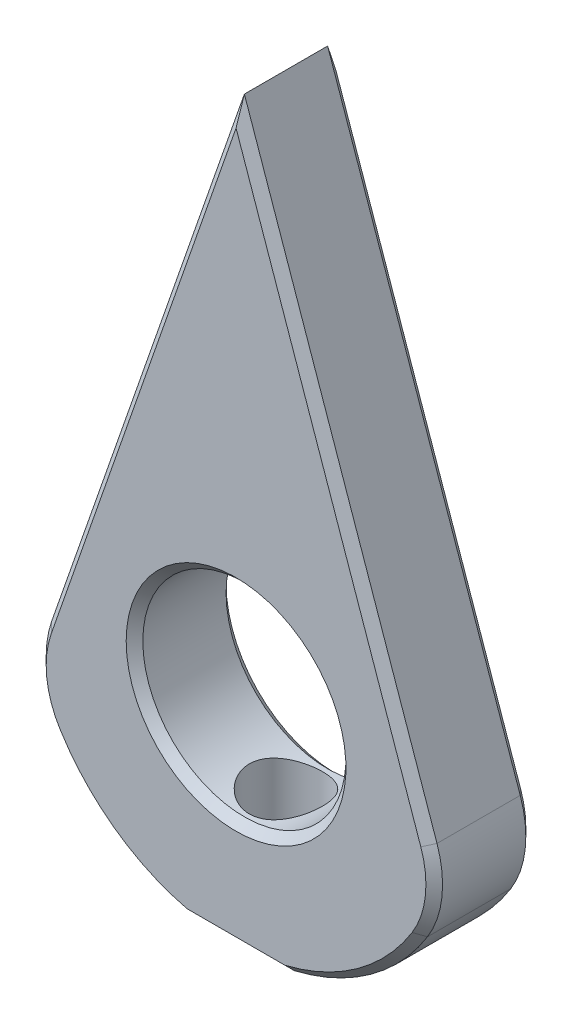
ISO-10303-21;
HEADER;
FILE_DESCRIPTION(('STEP AP214'),'2;1');
FILE_NAME('part.step','',(''),(''),'','','');
FILE_SCHEMA(('AUTOMOTIVE_DESIGN { 1 0 10303 214 1 1 1 1 }'));
ENDSEC;
DATA;
#1=APPLICATION_CONTEXT('core data for automotive mechanical design processes');
#2=APPLICATION_PROTOCOL_DEFINITION('international standard','automotive_design',2000,#1);
#3=PRODUCT_CONTEXT('',#1,'mechanical');
#4=PRODUCT('Part','Part','',(#3));
#5=PRODUCT_RELATED_PRODUCT_CATEGORY('part','',(#4));
#6=PRODUCT_DEFINITION_FORMATION('','',#4);
#7=PRODUCT_DEFINITION_CONTEXT('part definition',#1,'design');
#8=PRODUCT_DEFINITION('design','',#6,#7);
#9=PRODUCT_DEFINITION_SHAPE('','',#8);
#10=(LENGTH_UNIT() NAMED_UNIT(*) SI_UNIT(.MILLI.,.METRE.));
#11=(NAMED_UNIT(*) PLANE_ANGLE_UNIT() SI_UNIT($,.RADIAN.));
#12=(NAMED_UNIT(*) SI_UNIT($,.STERADIAN.) SOLID_ANGLE_UNIT());
#13=UNCERTAINTY_MEASURE_WITH_UNIT(LENGTH_MEASURE(1.E-05),#10,'distance_accuracy_value','');
#14=(GEOMETRIC_REPRESENTATION_CONTEXT(3) GLOBAL_UNCERTAINTY_ASSIGNED_CONTEXT((#13)) GLOBAL_UNIT_ASSIGNED_CONTEXT((#10,
#11,#12)) REPRESENTATION_CONTEXT('',''));
#15=CARTESIAN_POINT('',(0.,0.,0.));
#16=DIRECTION('',(0.,0.,1.));
#17=DIRECTION('',(1.,0.,0.));
#18=AXIS2_PLACEMENT_3D('',#15,#16,#17);
#19=CARTESIAN_POINT('',(0.,0.,6.));
#20=DIRECTION('',(0.,0.,-1.));
#21=DIRECTION('',(-1.,0.,0.));
#22=AXIS2_PLACEMENT_3D('',#19,#20,#21);
#23=PLANE('',#22);
#24=CARTESIAN_POINT('',(0.,0.,6.));
#25=DIRECTION('',(0.,0.,-1.));
#26=DIRECTION('',(-1.,0.,0.));
#27=AXIS2_PLACEMENT_3D('',#24,#25,#26);
#28=CIRCLE('',#27,6.59999999999999);
#29=CARTESIAN_POINT('',(-6.59999999999999,0.,6.));
#30=VERTEX_POINT('',#29);
#31=EDGE_CURVE('E11',#30,#30,#28,.T.);
#32=ORIENTED_EDGE('',*,*,#31,.T.);
#33=EDGE_LOOP('',(#32));
#34=FACE_BOUND('',#33,.T.);
#35=CARTESIAN_POINT('',(0.,0.,6.));
#36=DIRECTION('',(0.,0.,-1.));
#37=DIRECTION('',(-1.,0.,0.));
#38=AXIS2_PLACEMENT_3D('',#35,#36,#37);
#39=CIRCLE('',#38,12.4522198869537);
#40=CARTESIAN_POINT('',(-10.5754175678357,-6.57406444895071,6.));
#41=VERTEX_POINT('',#40);
#42=CARTESIAN_POINT('',(-2.94071081765043,-12.1,6.));
#43=VERTEX_POINT('',#42);
#44=EDGE_CURVE('E56',#41,#43,#39,.F.);
#45=ORIENTED_EDGE('',*,*,#44,.T.);
#46=DIRECTION('',(1.,0.,0.));
#47=VECTOR('',#46,1.);
#48=CARTESIAN_POINT('',(0.,-12.1,6.));
#49=LINE('',#48,#47);
#50=CARTESIAN_POINT('',(2.94071081765042,-12.1,6.));
#51=VERTEX_POINT('',#50);
#52=EDGE_CURVE('E48',#43,#51,#49,.T.);
#53=ORIENTED_EDGE('',*,*,#52,.T.);
#54=CARTESIAN_POINT('',(0.,0.,6.));
#55=DIRECTION('',(0.,0.,-1.));
#56=DIRECTION('',(-1.,0.,0.));
#57=AXIS2_PLACEMENT_3D('',#54,#55,#56);
#58=CIRCLE('',#57,12.4522198869537);
#59=CARTESIAN_POINT('',(10.5754175678357,-6.57406444895071,6.));
#60=VERTEX_POINT('',#59);
#61=EDGE_CURVE('E213',#51,#60,#58,.F.);
#62=ORIENTED_EDGE('',*,*,#61,.T.);
#63=CARTESIAN_POINT('',(5.90437921875903,-3.67037701028677,6.));
#64=DIRECTION('',(0.,0.,-1.));
#65=DIRECTION('',(-1.,0.,0.));
#66=AXIS2_PLACEMENT_3D('',#63,#64,#65);
#67=CIRCLE('',#66,5.5);
#68=CARTESIAN_POINT('',(11.0979555284929,-1.86019328619387,6.));
#69=VERTEX_POINT('',#68);
#70=EDGE_CURVE('E215',#60,#69,#67,.F.);
#71=ORIENTED_EDGE('',*,*,#70,.T.);
#72=DIRECTION('',(-0.329124313471436,0.9442866017698,0.));
#73=VECTOR('',#72,1.);
#74=CARTESIAN_POINT('',(9.31766860423954,3.24760647538266,6.));
#75=LINE('',#74,#73);
#76=CARTESIAN_POINT('',(0.,29.9808171881127,6.));
#77=VERTEX_POINT('',#76);
#78=EDGE_CURVE('E218',#69,#77,#75,.T.);
#79=ORIENTED_EDGE('',*,*,#78,.T.);
#80=DIRECTION('',(-0.329124313471435,-0.9442866017698,0.));
#81=VECTOR('',#80,1.);
#82=CARTESIAN_POINT('',(-9.31766860423954,3.24760647538266,6.));
#83=LINE('',#82,#81);
#84=CARTESIAN_POINT('',(-11.0979555284929,-1.86019328619387,6.));
#85=VERTEX_POINT('',#84);
#86=EDGE_CURVE('E221',#77,#85,#83,.T.);
#87=ORIENTED_EDGE('',*,*,#86,.T.);
#88=CARTESIAN_POINT('',(-5.90437921875903,-3.67037701028677,6.));
#89=DIRECTION('',(0.,0.,-1.));
#90=DIRECTION('',(-1.,0.,0.));
#91=AXIS2_PLACEMENT_3D('',#88,#89,#90);
#92=CIRCLE('',#91,5.5);
#93=EDGE_CURVE('E61',#85,#41,#92,.F.);
#94=ORIENTED_EDGE('',*,*,#93,.T.);
#95=EDGE_LOOP('',(#45,#53,#62,#71,#79,#87,#94));
#96=FACE_BOUND('',#95,.T.);
#97=ADVANCED_FACE('F38',(#34,#96),#23,.F.);
#98=CARTESIAN_POINT('',(0.,0.,0.));
#99=DIRECTION('',(0.,0.,-1.));
#100=DIRECTION('',(-1.,0.,0.));
#101=AXIS2_PLACEMENT_3D('',#98,#99,#100);
#102=PLANE('',#101);
#103=CARTESIAN_POINT('',(0.,0.,0.));
#104=DIRECTION('',(0.,0.,-1.));
#105=DIRECTION('',(-1.,0.,0.));
#106=AXIS2_PLACEMENT_3D('',#103,#104,#105);
#107=CIRCLE('',#106,6.59999999999999);
#108=CARTESIAN_POINT('',(-6.59999999999999,0.,0.));
#109=VERTEX_POINT('',#108);
#110=EDGE_CURVE('E169',#109,#109,#107,.F.);
#111=ORIENTED_EDGE('',*,*,#110,.T.);
#112=EDGE_LOOP('',(#111));
#113=FACE_BOUND('',#112,.T.);
#114=CARTESIAN_POINT('',(-5.90437921875903,-3.67037701028677,0.));
#115=DIRECTION('',(0.,0.,-1.));
#116=DIRECTION('',(-1.,0.,0.));
#117=AXIS2_PLACEMENT_3D('',#114,#115,#116);
#118=CIRCLE('',#117,5.50000000000001);
#119=CARTESIAN_POINT('',(-10.5754175678357,-6.57406444895071,0.));
#120=VERTEX_POINT('',#119);
#121=CARTESIAN_POINT('',(-11.0979555284929,-1.86019328619387,0.));
#122=VERTEX_POINT('',#121);
#123=EDGE_CURVE('E168',#120,#122,#118,.T.);
#124=ORIENTED_EDGE('',*,*,#123,.T.);
#125=DIRECTION('',(0.329124313471435,0.9442866017698,0.));
#126=VECTOR('',#125,1.);
#127=CARTESIAN_POINT('',(0.472143300884894,31.3354378432643,0.));
#128=LINE('',#127,#126);
#129=CARTESIAN_POINT('',(0.,29.9808171881128,0.));
#130=VERTEX_POINT('',#129);
#131=EDGE_CURVE('E147',#122,#130,#128,.T.);
#132=ORIENTED_EDGE('',*,*,#131,.T.);
#133=DIRECTION('',(0.329124313471436,-0.9442866017698,0.));
#134=VECTOR('',#133,1.);
#135=CARTESIAN_POINT('',(11.0979555284929,-1.86019328619387,0.));
#136=LINE('',#135,#134);
#137=CARTESIAN_POINT('',(11.0979555284929,-1.86019328619387,0.));
#138=VERTEX_POINT('',#137);
#139=EDGE_CURVE('E157',#130,#138,#136,.T.);
#140=ORIENTED_EDGE('',*,*,#139,.T.);
#141=CARTESIAN_POINT('',(5.90437921875903,-3.67037701028677,0.));
#142=DIRECTION('',(0.,0.,-1.));
#143=DIRECTION('',(-1.,0.,0.));
#144=AXIS2_PLACEMENT_3D('',#141,#142,#143);
#145=CIRCLE('',#144,5.50000000000001);
#146=CARTESIAN_POINT('',(10.5754175678357,-6.57406444895071,0.));
#147=VERTEX_POINT('',#146);
#148=EDGE_CURVE('E163',#138,#147,#145,.T.);
#149=ORIENTED_EDGE('',*,*,#148,.T.);
#150=CARTESIAN_POINT('',(0.,0.,0.));
#151=DIRECTION('',(0.,0.,-1.));
#152=DIRECTION('',(-1.,0.,0.));
#153=AXIS2_PLACEMENT_3D('',#150,#151,#152);
#154=CIRCLE('',#153,12.4522198869537);
#155=CARTESIAN_POINT('',(2.94071081765043,-12.1,0.));
#156=VERTEX_POINT('',#155);
#157=EDGE_CURVE('E507',#147,#156,#154,.T.);
#158=ORIENTED_EDGE('',*,*,#157,.T.);
#159=DIRECTION('',(-1.,0.,0.));
#160=VECTOR('',#159,1.);
#161=CARTESIAN_POINT('',(-3.,-12.1,0.));
#162=LINE('',#161,#160);
#163=CARTESIAN_POINT('',(-2.94071081765043,-12.1,0.));
#164=VERTEX_POINT('',#163);
#165=EDGE_CURVE('E509',#156,#164,#162,.T.);
#166=ORIENTED_EDGE('',*,*,#165,.T.);
#167=CARTESIAN_POINT('',(0.,0.,0.));
#168=DIRECTION('',(0.,0.,-1.));
#169=DIRECTION('',(-1.,0.,0.));
#170=AXIS2_PLACEMENT_3D('',#167,#168,#169);
#171=CIRCLE('',#170,12.4522198869537);
#172=EDGE_CURVE('E174',#164,#120,#171,.T.);
#173=ORIENTED_EDGE('',*,*,#172,.T.);
#174=EDGE_LOOP('',(#124,#132,#140,#149,#158,#166,#173));
#175=FACE_BOUND('',#174,.T.);
#176=ADVANCED_FACE('F166',(#113,#175),#102,.T.);
#177=CARTESIAN_POINT('',(0.,0.,6.));
#178=DIRECTION('',(0.,0.,-1.));
#179=DIRECTION('',(-1.,0.,0.));
#180=AXIS2_PLACEMENT_3D('',#177,#178,#179);
#181=CYLINDRICAL_SURFACE('',#180,12.9522198869537);
#182=DIRECTION('',(0.,0.,-1.));
#183=VECTOR('',#182,1.);
#184=CARTESIAN_POINT('',(-11.0000574177518,-6.83803603428379,6.));
#185=LINE('',#184,#183);
#186=CARTESIAN_POINT('',(-11.0000574177518,-6.83803603428379,5.49999999999999));
#187=VERTEX_POINT('',#186);
#188=CARTESIAN_POINT('',(-11.0000574177518,-6.83803603428379,0.499999999999994));
#189=VERTEX_POINT('',#188);
#190=EDGE_CURVE('E496',#187,#189,#185,.T.);
#191=ORIENTED_EDGE('',*,*,#190,.T.);
#192=CARTESIAN_POINT('',(0.,0.,0.499999999999994));
#193=DIRECTION('',(0.,0.,-1.));
#194=DIRECTION('',(-1.,0.,0.));
#195=AXIS2_PLACEMENT_3D('',#192,#193,#194);
#196=CIRCLE('',#195,12.9522198869537);
#197=CARTESIAN_POINT('',(-3.,-12.6,0.499999999999994));
#198=VERTEX_POINT('',#197);
#199=EDGE_CURVE('E193',#189,#198,#196,.F.);
#200=ORIENTED_EDGE('',*,*,#199,.T.);
#201=DIRECTION('',(0.,0.,-1.));
#202=VECTOR('',#201,1.);
#203=CARTESIAN_POINT('',(-3.,-12.6,6.));
#204=LINE('',#203,#202);
#205=CARTESIAN_POINT('',(-3.,-12.6,5.49999999999999));
#206=VERTEX_POINT('',#205);
#207=EDGE_CURVE('E500',#206,#198,#204,.T.);
#208=ORIENTED_EDGE('',*,*,#207,.F.);
#209=CARTESIAN_POINT('',(0.,0.,5.49999999999999));
#210=DIRECTION('',(0.,0.,-1.));
#211=DIRECTION('',(-1.,0.,0.));
#212=AXIS2_PLACEMENT_3D('',#209,#210,#211);
#213=CIRCLE('',#212,12.9522198869537);
#214=EDGE_CURVE('E191',#206,#187,#213,.T.);
#215=ORIENTED_EDGE('',*,*,#214,.T.);
#216=EDGE_LOOP('',(#191,#200,#208,#215));
#217=FACE_BOUND('',#216,.T.);
#218=ADVANCED_FACE('F345',(#217),#181,.T.);
#219=CARTESIAN_POINT('',(-3.,-12.6,6.));
#220=DIRECTION('',(0.,1.,0.));
#221=DIRECTION('',(0.,0.,1.));
#222=AXIS2_PLACEMENT_3D('',#219,#220,#221);
#223=PLANE('',#222);
#224=CARTESIAN_POINT('',(0.,-12.6,3.));
#225=DIRECTION('',(0.,-1.,0.));
#226=DIRECTION('',(0.,0.,-1.));
#227=AXIS2_PLACEMENT_3D('',#224,#225,#226);
#228=CIRCLE('',#227,2.2);
#229=CARTESIAN_POINT('',(0.,-12.6,0.8));
#230=VERTEX_POINT('',#229);
#231=EDGE_CURVE('E532',#230,#230,#228,.T.);
#232=ORIENTED_EDGE('',*,*,#231,.F.);
#233=EDGE_LOOP('',(#232));
#234=FACE_BOUND('',#233,.T.);
#235=ORIENTED_EDGE('',*,*,#207,.T.);
#236=DIRECTION('',(1.,0.,0.));
#237=VECTOR('',#236,1.);
#238=CARTESIAN_POINT('',(3.,-12.6,0.499999999999994));
#239=LINE('',#238,#237);
#240=CARTESIAN_POINT('',(3.,-12.6,0.499999999999994));
#241=VERTEX_POINT('',#240);
#242=EDGE_CURVE('E198',#198,#241,#239,.T.);
#243=ORIENTED_EDGE('',*,*,#242,.T.);
#244=DIRECTION('',(0.,0.,-1.));
#245=VECTOR('',#244,1.);
#246=CARTESIAN_POINT('',(3.,-12.6,6.));
#247=LINE('',#246,#245);
#248=CARTESIAN_POINT('',(3.,-12.6,5.49999999999999));
#249=VERTEX_POINT('',#248);
#250=EDGE_CURVE('E528',#249,#241,#247,.T.);
#251=ORIENTED_EDGE('',*,*,#250,.F.);
#252=DIRECTION('',(-1.,0.,0.));
#253=VECTOR('',#252,1.);
#254=CARTESIAN_POINT('',(-3.,-12.6,5.49999999999999));
#255=LINE('',#254,#253);
#256=EDGE_CURVE('E195',#249,#206,#255,.T.);
#257=ORIENTED_EDGE('',*,*,#256,.T.);
#258=EDGE_LOOP('',(#235,#243,#251,#257));
#259=FACE_BOUND('',#258,.T.);
#260=ADVANCED_FACE('F363',(#234,#259),#223,.F.);
#261=CARTESIAN_POINT('',(0.,0.,6.));
#262=DIRECTION('',(0.,0.,-1.));
#263=DIRECTION('',(-1.,0.,0.));
#264=AXIS2_PLACEMENT_3D('',#261,#262,#263);
#265=CYLINDRICAL_SURFACE('',#264,12.9522198869537);
#266=ORIENTED_EDGE('',*,*,#250,.T.);
#267=CARTESIAN_POINT('',(0.,0.,0.499999999999994));
#268=DIRECTION('',(0.,0.,-1.));
#269=DIRECTION('',(-1.,0.,0.));
#270=AXIS2_PLACEMENT_3D('',#267,#268,#269);
#271=CIRCLE('',#270,12.9522198869537);
#272=CARTESIAN_POINT('',(11.0000574177518,-6.83803603428379,0.499999999999994));
#273=VERTEX_POINT('',#272);
#274=EDGE_CURVE('E202',#241,#273,#271,.F.);
#275=ORIENTED_EDGE('',*,*,#274,.T.);
#276=DIRECTION('',(0.,0.,-1.));
#277=VECTOR('',#276,1.);
#278=CARTESIAN_POINT('',(11.0000574177518,-6.83803603428379,6.));
#279=LINE('',#278,#277);
#280=CARTESIAN_POINT('',(11.0000574177518,-6.83803603428379,5.49999999999999));
#281=VERTEX_POINT('',#280);
#282=EDGE_CURVE('E489',#273,#281,#279,.F.);
#283=ORIENTED_EDGE('',*,*,#282,.T.);
#284=CARTESIAN_POINT('',(0.,0.,5.49999999999999));
#285=DIRECTION('',(0.,0.,-1.));
#286=DIRECTION('',(-1.,0.,0.));
#287=AXIS2_PLACEMENT_3D('',#284,#285,#286);
#288=CIRCLE('',#287,12.9522198869537);
#289=EDGE_CURVE('E200',#281,#249,#288,.T.);
#290=ORIENTED_EDGE('',*,*,#289,.T.);
#291=EDGE_LOOP('',(#266,#275,#283,#290));
#292=FACE_BOUND('',#291,.T.);
#293=ADVANCED_FACE('F359',(#292),#265,.T.);
#294=CARTESIAN_POINT('',(12.3450693198141,-3.9190896250258,6.));
#295=DIRECTION('',(-0.9442866017698,-0.329124313471436,0.));
#296=DIRECTION('',(0.329124313471436,-0.9442866017698,0.));
#297=AXIS2_PLACEMENT_3D('',#294,#295,#296);
#298=PLANE('',#297);
#299=DIRECTION('',(0.,0.,-1.));
#300=VECTOR('',#299,1.);
#301=CARTESIAN_POINT('',(11.5700988293778,-1.69563112945815,6.));
#302=LINE('',#301,#300);
#303=CARTESIAN_POINT('',(11.5700988293778,-1.69563112945815,5.49999999999999));
#304=VERTEX_POINT('',#303);
#305=CARTESIAN_POINT('',(11.5700988293778,-1.69563112945815,0.499999999999996));
#306=VERTEX_POINT('',#305);
#307=EDGE_CURVE('E492',#304,#306,#302,.T.);
#308=ORIENTED_EDGE('',*,*,#307,.T.);
#309=DIRECTION('',(-0.329124313471436,0.9442866017698,0.));
#310=VECTOR('',#309,1.);
#311=CARTESIAN_POINT('',(0.,31.5,0.499999999999996));
#312=LINE('',#311,#310);
#313=CARTESIAN_POINT('',(0.,31.5,0.499999999999996));
#314=VERTEX_POINT('',#313);
#315=EDGE_CURVE('E211',#306,#314,#312,.T.);
#316=ORIENTED_EDGE('',*,*,#315,.T.);
#317=DIRECTION('',(0.,0.,-1.));
#318=VECTOR('',#317,1.);
#319=CARTESIAN_POINT('',(0.,31.5,6.));
#320=LINE('',#319,#318);
#321=CARTESIAN_POINT('',(0.,31.5,5.49999999999999));
#322=VERTEX_POINT('',#321);
#323=EDGE_CURVE('E520',#322,#314,#320,.T.);
#324=ORIENTED_EDGE('',*,*,#323,.F.);
#325=DIRECTION('',(0.329124313471436,-0.9442866017698,0.));
#326=VECTOR('',#325,1.);
#327=CARTESIAN_POINT('',(12.3450693198141,-3.9190896250258,5.49999999999999));
#328=LINE('',#327,#326);
#329=EDGE_CURVE('E208',#322,#304,#328,.T.);
#330=ORIENTED_EDGE('',*,*,#329,.T.);
#331=EDGE_LOOP('',(#308,#316,#324,#330));
#332=FACE_BOUND('',#331,.T.);
#333=ADVANCED_FACE('F355',(#332),#298,.F.);
#334=CARTESIAN_POINT('',(-12.3450693198141,-3.9190896250258,6.));
#335=DIRECTION('',(0.9442866017698,-0.329124313471435,0.));
#336=DIRECTION('',(0.329124313471435,0.9442866017698,0.));
#337=AXIS2_PLACEMENT_3D('',#334,#335,#336);
#338=PLANE('',#337);
#339=ORIENTED_EDGE('',*,*,#323,.T.);
#340=DIRECTION('',(-0.329124313471435,-0.9442866017698,0.));
#341=VECTOR('',#340,1.);
#342=CARTESIAN_POINT('',(-11.5700988293778,-1.69563112945816,0.499999999999994));
#343=LINE('',#342,#341);
#344=CARTESIAN_POINT('',(-11.5700988293778,-1.69563112945816,0.499999999999994));
#345=VERTEX_POINT('',#344);
#346=EDGE_CURVE('E150',#314,#345,#343,.T.);
#347=ORIENTED_EDGE('',*,*,#346,.T.);
#348=DIRECTION('',(0.,0.,-1.));
#349=VECTOR('',#348,1.);
#350=CARTESIAN_POINT('',(-11.5700988293778,-1.69563112945816,6.));
#351=LINE('',#350,#349);
#352=CARTESIAN_POINT('',(-11.5700988293778,-1.69563112945816,5.49999999999999));
#353=VERTEX_POINT('',#352);
#354=EDGE_CURVE('E164',#345,#353,#351,.F.);
#355=ORIENTED_EDGE('',*,*,#354,.T.);
#356=DIRECTION('',(0.329124313471435,0.9442866017698,0.));
#357=VECTOR('',#356,1.);
#358=CARTESIAN_POINT('',(-12.3450693198141,-3.9190896250258,5.49999999999999));
#359=LINE('',#358,#357);
#360=EDGE_CURVE('E183',#353,#322,#359,.T.);
#361=ORIENTED_EDGE('',*,*,#360,.T.);
#362=EDGE_LOOP('',(#339,#347,#355,#361));
#363=FACE_BOUND('',#362,.T.);
#364=ADVANCED_FACE('F352',(#363),#338,.F.);
#365=CARTESIAN_POINT('',(0.,0.,6.));
#366=DIRECTION('',(0.,0.,-1.));
#367=DIRECTION('',(-1.,0.,0.));
#368=AXIS2_PLACEMENT_3D('',#365,#366,#367);
#369=CYLINDRICAL_SURFACE('',#368,6.1);
#370=CARTESIAN_POINT('',(0.,0.,0.499999999999995));
#371=DIRECTION('',(0.,0.,-1.));
#372=DIRECTION('',(-1.,0.,0.));
#373=AXIS2_PLACEMENT_3D('',#370,#371,#372);
#374=CIRCLE('',#373,6.1);
#375=CARTESIAN_POINT('',(-6.1,0.,0.499999999999995));
#376=VERTEX_POINT('',#375);
#377=EDGE_CURVE('E180',#376,#376,#374,.T.);
#378=ORIENTED_EDGE('',*,*,#377,.T.);
#379=EDGE_LOOP('',(#378));
#380=FACE_BOUND('',#379,.T.);
#381=CARTESIAN_POINT('',(0.,0.,5.50000000000001));
#382=DIRECTION('',(0.,0.,-1.));
#383=DIRECTION('',(-1.,0.,0.));
#384=AXIS2_PLACEMENT_3D('',#381,#382,#383);
#385=CIRCLE('',#384,6.1);
#386=CARTESIAN_POINT('',(-6.1,0.,5.50000000000001));
#387=VERTEX_POINT('',#386);
#388=EDGE_CURVE('E172',#387,#387,#385,.F.);
#389=ORIENTED_EDGE('',*,*,#388,.T.);
#390=EDGE_LOOP('',(#389));
#391=FACE_BOUND('',#390,.T.);
#392=CARTESIAN_POINT('',(0.,-6.1,0.8));
#393=CARTESIAN_POINT('',(0.119462701783628,-6.10000203898042,0.799997190141798));
#394=CARTESIAN_POINT('',(0.238905516815724,-6.09645944741529,0.80976136571471));
#395=CARTESIAN_POINT('',(0.474239316517873,-6.08267945677628,0.848415924064153));
#396=CARTESIAN_POINT('',(0.590130510696511,-6.07244245340175,0.877305176379596));
#397=CARTESIAN_POINT('',(0.814934100747374,-6.04637734976254,0.953067327422908));
#398=CARTESIAN_POINT('',(0.923858903093019,-6.03055953556649,0.999907154800949));
#399=CARTESIAN_POINT('',(1.13230121303852,-5.99492197603269,1.11007927439942));
#400=CARTESIAN_POINT('',(1.2318164034109,-5.97510124867953,1.17341561473661));
#401=CARTESIAN_POINT('',(1.42256824035643,-5.93263802209552,1.31741641100504));
#402=CARTESIAN_POINT('',(1.51338073625475,-5.90991988497167,1.39862023518781));
#403=CARTESIAN_POINT('',(1.68043419837985,-5.8646096670645,1.57490555108911));
#404=CARTESIAN_POINT('',(1.75667117702056,-5.84201762241413,1.66999082799881));
#405=CARTESIAN_POINT('',(1.89500659122704,-5.79865488797824,1.87536728379252));
#406=CARTESIAN_POINT('',(1.95652302971254,-5.77797453114782,1.98607143609168));
#407=CARTESIAN_POINT('',(2.05987784453913,-5.74194404585967,2.21711916166413));
#408=CARTESIAN_POINT('',(2.10172341130256,-5.72659197025829,2.33745919381664));
#409=CARTESIAN_POINT('',(2.16290350607824,-5.70376051851583,2.57949812068123));
#410=CARTESIAN_POINT('',(2.1830426798905,-5.6960008003085,2.70096632715544));
#411=CARTESIAN_POINT('',(2.20275447117934,-5.68840886121328,2.94578679197966));
#412=CARTESIAN_POINT('',(2.20233478438484,-5.68857367396202,3.06913832806436));
#413=CARTESIAN_POINT('',(2.18155935781807,-5.69656903529549,3.30704761483581));
#414=CARTESIAN_POINT('',(2.16229519593417,-5.70397984419256,3.42171734901053));
#415=CARTESIAN_POINT('',(2.10617371413127,-5.72493844217071,3.64607156513603));
#416=CARTESIAN_POINT('',(2.06931394424835,-5.73848708585356,3.75575535052711));
#417=CARTESIAN_POINT('',(1.97840819087429,-5.77046359422325,3.96933884357128));
#418=CARTESIAN_POINT('',(1.92406499658505,-5.78897484016708,4.07309902206427));
#419=CARTESIAN_POINT('',(1.79994172724951,-5.82876047768186,4.27035439690486));
#420=CARTESIAN_POINT('',(1.73015661508059,-5.85003576994205,4.36384622881356));
#421=CARTESIAN_POINT('',(1.57204802279896,-5.89455733028248,4.5439872633829));
#422=CARTESIAN_POINT('',(1.48284547864088,-5.9178441546015,4.62985667413487));
#423=CARTESIAN_POINT('',(1.29103023067692,-5.96262778662795,4.78563941714165));
#424=CARTESIAN_POINT('',(1.18841576649482,-5.98412435874909,4.85555065149831));
#425=CARTESIAN_POINT('',(0.970820802711884,-6.0232774881679,4.97820729053415));
#426=CARTESIAN_POINT('',(0.855693570902698,-6.04087898042753,5.03071120242362));
#427=CARTESIAN_POINT('',(0.617449645519097,-6.06985382530859,5.11535308516554));
#428=CARTESIAN_POINT('',(0.494336246074272,-6.08122972781467,5.14749939495872));
#429=CARTESIAN_POINT('',(0.250191484886792,-6.09603255892376,5.18905661185544));
#430=CARTESIAN_POINT('',(0.129361140932052,-6.09982671633393,5.19951882166343));
#431=CARTESIAN_POINT('',(-0.112373181315734,-6.10016145633383,5.20044838412049));
#432=CARTESIAN_POINT('',(-0.233277139770624,-6.09670350598369,5.19091978079712));
#433=CARTESIAN_POINT('',(-0.467303667498972,-6.08316523634742,5.15294988511283));
#434=CARTESIAN_POINT('',(-0.580550494124693,-6.07332077340836,5.12518174574492));
#435=CARTESIAN_POINT('',(-0.800710981454225,-6.04823509785869,5.05239132214685));
#436=CARTESIAN_POINT('',(-0.907623816878045,-6.03299318379075,5.00736679519927));
#437=CARTESIAN_POINT('',(-1.1154842886983,-5.99809333565152,4.89993976189635));
#438=CARTESIAN_POINT('',(-1.21617558032547,-5.97832207339805,4.83707917284438));
#439=CARTESIAN_POINT('',(-1.4059057733118,-5.93657152185401,4.69628882124053));
#440=CARTESIAN_POINT('',(-1.49494059697627,-5.91459146460485,4.61835380881065));
#441=CARTESIAN_POINT('',(-1.66381005324387,-5.86939410351069,4.44470574312622));
#442=CARTESIAN_POINT('',(-1.74289648783361,-5.84617358777497,4.34826405607428));
#443=CARTESIAN_POINT('',(-1.88389117107949,-5.80227743711218,4.14300294627265));
#444=CARTESIAN_POINT('',(-1.94579845570579,-5.78160194503856,4.03418282937457));
#445=CARTESIAN_POINT('',(-2.05059436290355,-5.74527293522092,3.80669860448876));
#446=CARTESIAN_POINT('',(-2.09345204626981,-5.72962759846664,3.68801885136578));
#447=CARTESIAN_POINT('',(-2.15832360807292,-5.70551139318915,3.44441384260092));
#448=CARTESIAN_POINT('',(-2.18034908336955,-5.69703653328705,3.31949210257235));
#449=CARTESIAN_POINT('',(-2.20193829797968,-5.68872468145521,3.07498682250308));
#450=CARTESIAN_POINT('',(-2.20276553511545,-5.68840181676614,2.95553032346489));
#451=CARTESIAN_POINT('',(-2.18512675183762,-5.69520048120631,2.71827758806454));
#452=CARTESIAN_POINT('',(-2.16666229217526,-5.70232140811241,2.60048121817472));
#453=CARTESIAN_POINT('',(-2.11191843789477,-5.72281528565109,2.37299262254838));
#454=CARTESIAN_POINT('',(-2.07611636655997,-5.73602028687265,2.26316914612596));
#455=CARTESIAN_POINT('',(-1.98812087905322,-5.76710866193333,2.05101484516758));
#456=CARTESIAN_POINT('',(-1.93592347740741,-5.78499317311871,1.94868584990077));
#457=CARTESIAN_POINT('',(-1.81361648093514,-5.8245269942411,1.74892797669074));
#458=CARTESIAN_POINT('',(-1.74274854593082,-5.84631877497864,1.651991894905));
#459=CARTESIAN_POINT('',(-1.58632371232395,-5.89068586397599,1.47098222685263));
#460=CARTESIAN_POINT('',(-1.50076232763092,-5.91326140984445,1.38691258373652));
#461=CARTESIAN_POINT('',(-1.31240970194581,-5.95796777802448,1.22987946165815));
#462=CARTESIAN_POINT('',(-1.20898396768315,-5.98002389634077,1.15765261530508));
#463=CARTESIAN_POINT('',(-0.990699595691663,-6.02003411280841,1.0316529307116));
#464=CARTESIAN_POINT('',(-0.875841493234715,-6.0379884028808,0.977879229005227));
#465=CARTESIAN_POINT('',(-0.636450166927239,-6.06791823122041,0.890174992201684));
#466=CARTESIAN_POINT('',(-0.511819309438176,-6.07982121590066,0.856484459510837));
#467=CARTESIAN_POINT('',(-0.258116670547381,-6.09585940626042,0.811403053541958));
#468=CARTESIAN_POINT('',(-0.12904673246286,-6.09999779744006,0.800003035282261));
#469=CARTESIAN_POINT('',(0.,-6.1,0.8));
#470=B_SPLINE_CURVE_WITH_KNOTS('',3,(#392,#393,#394,#395,#396,#397,#398,#399,#400,#401,#402,
#403,#404,#405,#406,#407,#408,#409,#410,#411,#412,#413,#414,#415,#416,#417,#418,#419,#420,#421,
#422,#423,#424,#425,#426,#427,#428,#429,#430,#431,#432,#433,#434,#435,#436,#437,#438,#439,#440,
#441,#442,#443,#444,#445,#446,#447,#448,#449,#450,#451,#452,#453,#454,#455,#456,#457,#458,#459,
#460,#461,#462,#463,#464,#465,#466,#467,#468,#469),.UNSPECIFIED.,.T.,.F.,(4,2,2,2,2,2,2,2,2,2,2,
2,2,2,2,2,2,2,2,2,2,2,2,2,2,2,2,2,2,2,2,2,2,2,2,2,2,2,4),(0.,0.357912491086863,
0.715803828270481,1.07303894761987,1.43036181243359,1.80048231343016,2.17070392795776,
2.55376448521347,2.93668491074784,3.3048629713769,3.67290321420839,4.02081497019132,
4.36877518258295,4.72299432414181,5.07732918205357,5.45355903896538,5.82983832746112,
6.21113835859413,6.59228209928927,6.95446822011734,7.31658107982225,7.66602856465152,
8.01552148064986,8.37496035147962,8.73452462803082,9.11334762647359,9.49219187875343,
9.87164919843847,10.2508951575318,10.6074803783905,10.9640367527595,11.311291272109,
11.6586302695537,12.0231511922394,12.3877836061445,12.7701050617797,13.1524086252563,
13.5391937687883,13.9258201952193),.UNSPECIFIED.);
#471=CARTESIAN_POINT('',(0.,-6.1,0.8));
#472=VERTEX_POINT('',#471);
#473=EDGE_CURVE('E281',#472,#472,#470,.T.);
#474=ORIENTED_EDGE('',*,*,#473,.T.);
#475=EDGE_LOOP('',(#474));
#476=FACE_BOUND('',#475,.T.);
#477=ADVANCED_FACE('F349',(#380,#391,#476),#369,.F.);
#478=CARTESIAN_POINT('',(0.,31.501,3.));
#479=DIRECTION('',(0.,-1.,0.));
#480=DIRECTION('',(0.,0.,-1.));
#481=AXIS2_PLACEMENT_3D('',#478,#479,#480);
#482=CYLINDRICAL_SURFACE('',#481,2.2);
#483=ORIENTED_EDGE('',*,*,#473,.F.);
#484=EDGE_LOOP('',(#483));
#485=FACE_BOUND('',#484,.T.);
#486=ORIENTED_EDGE('',*,*,#231,.T.);
#487=EDGE_LOOP('',(#486));
#488=FACE_BOUND('',#487,.T.);
#489=ADVANCED_FACE('F375',(#485,#488),#482,.F.);
#490=CARTESIAN_POINT('',(5.90437921875903,-3.67037701028677,6.));
#491=DIRECTION('',(0.,0.,-1.));
#492=DIRECTION('',(-1.,0.,0.));
#493=AXIS2_PLACEMENT_3D('',#490,#491,#492);
#494=CYLINDRICAL_SURFACE('',#493,6.);
#495=ORIENTED_EDGE('',*,*,#282,.F.);
#496=CARTESIAN_POINT('',(5.90437921875903,-3.67037701028677,0.499999999999994));
#497=DIRECTION('',(0.,0.,-1.));
#498=DIRECTION('',(-1.,0.,0.));
#499=AXIS2_PLACEMENT_3D('',#496,#497,#498);
#500=CIRCLE('',#499,6.);
#501=EDGE_CURVE('E206',#273,#306,#500,.F.);
#502=ORIENTED_EDGE('',*,*,#501,.T.);
#503=ORIENTED_EDGE('',*,*,#307,.F.);
#504=CARTESIAN_POINT('',(5.90437921875903,-3.67037701028677,5.49999999999999));
#505=DIRECTION('',(0.,0.,-1.));
#506=DIRECTION('',(-1.,0.,0.));
#507=AXIS2_PLACEMENT_3D('',#504,#505,#506);
#508=CIRCLE('',#507,6.);
#509=EDGE_CURVE('E204',#304,#281,#508,.T.);
#510=ORIENTED_EDGE('',*,*,#509,.T.);
#511=EDGE_LOOP('',(#495,#502,#503,#510));
#512=FACE_BOUND('',#511,.T.);
#513=ADVANCED_FACE('F371',(#512),#494,.T.);
#514=CARTESIAN_POINT('',(-5.90437921875903,-3.67037701028677,6.));
#515=DIRECTION('',(0.,0.,-1.));
#516=DIRECTION('',(-1.,0.,0.));
#517=AXIS2_PLACEMENT_3D('',#514,#515,#516);
#518=CYLINDRICAL_SURFACE('',#517,6.);
#519=ORIENTED_EDGE('',*,*,#354,.F.);
#520=CARTESIAN_POINT('',(-5.90437921875903,-3.67037701028677,0.499999999999994));
#521=DIRECTION('',(0.,0.,-1.));
#522=DIRECTION('',(-1.,0.,0.));
#523=AXIS2_PLACEMENT_3D('',#520,#521,#522);
#524=CIRCLE('',#523,6.);
#525=EDGE_CURVE('E189',#345,#189,#524,.F.);
#526=ORIENTED_EDGE('',*,*,#525,.T.);
#527=ORIENTED_EDGE('',*,*,#190,.F.);
#528=CARTESIAN_POINT('',(-5.90437921875903,-3.67037701028677,5.49999999999999));
#529=DIRECTION('',(0.,0.,-1.));
#530=DIRECTION('',(-1.,0.,0.));
#531=AXIS2_PLACEMENT_3D('',#528,#529,#530);
#532=CIRCLE('',#531,6.);
#533=EDGE_CURVE('E187',#187,#353,#532,.T.);
#534=ORIENTED_EDGE('',*,*,#533,.T.);
#535=EDGE_LOOP('',(#519,#526,#527,#534));
#536=FACE_BOUND('',#535,.T.);
#537=ADVANCED_FACE('F374',(#536),#518,.T.);
#538=CARTESIAN_POINT('',(0.,0.,0.));
#539=DIRECTION('',(0.,0.,-1.));
#540=DIRECTION('',(-1.,0.,0.));
#541=AXIS2_PLACEMENT_3D('',#538,#539,#540);
#542=CONICAL_SURFACE('',#541,6.59999999999999,0.785398163397445);
#543=ORIENTED_EDGE('',*,*,#377,.F.);
#544=EDGE_LOOP('',(#543));
#545=FACE_BOUND('',#544,.T.);
#546=ORIENTED_EDGE('',*,*,#110,.F.);
#547=EDGE_LOOP('',(#546));
#548=FACE_BOUND('',#547,.T.);
#549=ADVANCED_FACE('F269',(#545,#548),#542,.F.);
#550=CARTESIAN_POINT('',(0.,0.,0.499999999999994));
#551=DIRECTION('',(0.,0.,1.));
#552=DIRECTION('',(1.,0.,0.));
#553=AXIS2_PLACEMENT_3D('',#550,#551,#552);
#554=CONICAL_SURFACE('',#553,12.9522198869537,0.78539816339745);
#555=DIRECTION('',(-0.600531434875375,0.373312196059176,-0.707106781186546));
#556=VECTOR('',#555,1.);
#557=CARTESIAN_POINT('',(11.0000574177518,-6.83803603428379,0.499999999999994));
#558=LINE('',#557,#556);
#559=EDGE_CURVE('E240',#273,#147,#558,.T.);
#560=ORIENTED_EDGE('',*,*,#559,.F.);
#561=ORIENTED_EDGE('',*,*,#274,.F.);
#562=CARTESIAN_POINT('',(3.,-12.6,0.499999999999994));
#563=CARTESIAN_POINT('',(2.99021640023335,-12.5166608607251,0.416660860725104));
#564=CARTESIAN_POINT('',(2.98038383517119,-12.4333246245626,0.33332462456255));
#565=CARTESIAN_POINT('',(2.96062077438866,-12.2666579578959,0.166657957895846));
#566=CARTESIAN_POINT('',(2.95069027866764,-12.1833275273917,0.0833275273917362));
#567=CARTESIAN_POINT('',(2.94071081765043,-12.1,0.));
#568=B_SPLINE_CURVE_WITH_KNOTS('',3,(#562,#563,#564,#565,#566,#567),.UNSPECIFIED.,.F.,.F.,(4,2,
4),(0.,0.354794056687334,0.709588115785557),.UNSPECIFIED.);
#569=EDGE_CURVE('E274',#156,#241,#568,.F.);
#570=ORIENTED_EDGE('',*,*,#569,.F.);
#571=ORIENTED_EDGE('',*,*,#157,.F.);
#572=EDGE_LOOP('',(#560,#561,#570,#571));
#573=FACE_BOUND('',#572,.T.);
#574=ADVANCED_FACE('F262',(#573),#554,.T.);
#575=CARTESIAN_POINT('',(-3.,-12.6,0.499999999999994));
#576=DIRECTION('',(0.,-0.707106781186546,-0.707106781186549));
#577=DIRECTION('',(-1.,0.,0.));
#578=AXIS2_PLACEMENT_3D('',#575,#576,#577);
#579=PLANE('',#578);
#580=ORIENTED_EDGE('',*,*,#569,.T.);
#581=ORIENTED_EDGE('',*,*,#242,.F.);
#582=CARTESIAN_POINT('',(-3.,-12.6,0.499999999999994));
#583=CARTESIAN_POINT('',(-2.99021640023335,-12.5166608607251,0.416660860725104));
#584=CARTESIAN_POINT('',(-2.98038383517118,-12.4333246245626,0.33332462456255));
#585=CARTESIAN_POINT('',(-2.96062077438866,-12.2666579578959,0.166657957895846));
#586=CARTESIAN_POINT('',(-2.95069027866763,-12.1833275273917,0.0833275273917362));
#587=CARTESIAN_POINT('',(-2.94071081765042,-12.1,0.));
#588=B_SPLINE_CURVE_WITH_KNOTS('',3,(#582,#583,#584,#585,#586,#587),.UNSPECIFIED.,.F.,.F.,(4,2,
4),(0.,0.354794056687334,0.709588115785557),.UNSPECIFIED.);
#589=EDGE_CURVE('E231',#164,#198,#588,.F.);
#590=ORIENTED_EDGE('',*,*,#589,.F.);
#591=ORIENTED_EDGE('',*,*,#165,.F.);
#592=EDGE_LOOP('',(#580,#581,#590,#591));
#593=FACE_BOUND('',#592,.T.);
#594=ADVANCED_FACE('F243',(#593),#579,.T.);
#595=CARTESIAN_POINT('',(5.90437921875903,-3.67037701028677,0.));
#596=DIRECTION('',(0.,0.,1.));
#597=DIRECTION('',(1.,0.,0.));
#598=AXIS2_PLACEMENT_3D('',#595,#596,#597);
#599=CONICAL_SURFACE('',#598,5.50000000000001,0.78539816339745);
#600=ORIENTED_EDGE('',*,*,#559,.T.);
#601=ORIENTED_EDGE('',*,*,#148,.F.);
#602=DIRECTION('',(-0.667711459495027,-0.23272603390902,-0.707106781186547));
#603=VECTOR('',#602,1.);
#604=CARTESIAN_POINT('',(11.5700988293778,-1.69563112945815,0.499999999999994));
#605=LINE('',#604,#603);
#606=EDGE_CURVE('E160',#306,#138,#605,.T.);
#607=ORIENTED_EDGE('',*,*,#606,.F.);
#608=ORIENTED_EDGE('',*,*,#501,.F.);
#609=EDGE_LOOP('',(#600,#601,#607,#608));
#610=FACE_BOUND('',#609,.T.);
#611=ADVANCED_FACE('F254',(#610),#599,.T.);
#612=CARTESIAN_POINT('',(0.,0.,0.499999999999994));
#613=DIRECTION('',(0.,0.,1.));
#614=DIRECTION('',(1.,0.,0.));
#615=AXIS2_PLACEMENT_3D('',#612,#613,#614);
#616=CONICAL_SURFACE('',#615,12.9522198869537,0.78539816339745);
#617=ORIENTED_EDGE('',*,*,#589,.T.);
#618=ORIENTED_EDGE('',*,*,#199,.F.);
#619=DIRECTION('',(-0.600531434875375,-0.373312196059176,0.707106781186546));
#620=VECTOR('',#619,1.);
#621=CARTESIAN_POINT('',(-10.5754175678357,-6.57406444895071,0.));
#622=LINE('',#621,#620);
#623=EDGE_CURVE('E153',#120,#189,#622,.T.);
#624=ORIENTED_EDGE('',*,*,#623,.F.);
#625=ORIENTED_EDGE('',*,*,#172,.F.);
#626=EDGE_LOOP('',(#617,#618,#624,#625));
#627=FACE_BOUND('',#626,.T.);
#628=ADVANCED_FACE('F247',(#627),#616,.T.);
#629=CARTESIAN_POINT('',(12.3450693198141,-3.9190896250258,0.499999999999994));
#630=DIRECTION('',(0.667711459495026,0.232726033909019,-0.707106781186548));
#631=DIRECTION('',(0.329124313471436,-0.9442866017698,0.));
#632=AXIS2_PLACEMENT_3D('',#629,#630,#631);
#633=PLANE('',#632);
#634=ORIENTED_EDGE('',*,*,#606,.T.);
#635=ORIENTED_EDGE('',*,*,#139,.F.);
#636=DIRECTION('',(0.,0.949875888120208,0.312627249560633));
#637=VECTOR('',#636,1.);
#638=CARTESIAN_POINT('',(0.,-0.457376665564515,-10.017949655402));
#639=LINE('',#638,#637);
#640=EDGE_CURVE('E143',#314,#130,#639,.F.);
#641=ORIENTED_EDGE('',*,*,#640,.F.);
#642=ORIENTED_EDGE('',*,*,#315,.F.);
#643=EDGE_LOOP('',(#634,#635,#641,#642));
#644=FACE_BOUND('',#643,.T.);
#645=ADVANCED_FACE('F158',(#644),#633,.T.);
#646=CARTESIAN_POINT('',(-5.90437921875903,-3.67037701028677,0.));
#647=DIRECTION('',(0.,0.,1.));
#648=DIRECTION('',(1.,0.,0.));
#649=AXIS2_PLACEMENT_3D('',#646,#647,#648);
#650=CONICAL_SURFACE('',#649,5.50000000000001,0.785398163397449);
#651=ORIENTED_EDGE('',*,*,#623,.T.);
#652=ORIENTED_EDGE('',*,*,#525,.F.);
#653=DIRECTION('',(-0.667711459495027,0.232726033909019,0.707106781186547));
#654=VECTOR('',#653,1.);
#655=CARTESIAN_POINT('',(-11.0979555284929,-1.86019328619387,0.));
#656=LINE('',#655,#654);
#657=EDGE_CURVE('E154',#122,#345,#656,.T.);
#658=ORIENTED_EDGE('',*,*,#657,.F.);
#659=ORIENTED_EDGE('',*,*,#123,.F.);
#660=EDGE_LOOP('',(#651,#652,#658,#659));
#661=FACE_BOUND('',#660,.T.);
#662=ADVANCED_FACE('F391',(#661),#650,.T.);
#663=CARTESIAN_POINT('',(-12.3450693198141,-3.9190896250258,0.499999999999994));
#664=DIRECTION('',(-0.667711459495025,0.232726033909019,-0.707106781186548));
#665=DIRECTION('',(0.329124313471435,0.9442866017698,0.));
#666=AXIS2_PLACEMENT_3D('',#663,#664,#665);
#667=PLANE('',#666);
#668=ORIENTED_EDGE('',*,*,#640,.T.);
#669=ORIENTED_EDGE('',*,*,#131,.F.);
#670=ORIENTED_EDGE('',*,*,#657,.T.);
#671=ORIENTED_EDGE('',*,*,#346,.F.);
#672=EDGE_LOOP('',(#668,#669,#670,#671));
#673=FACE_BOUND('',#672,.T.);
#674=ADVANCED_FACE('F145',(#673),#667,.T.);
#675=CARTESIAN_POINT('',(0.,0.,5.50000000000001));
#676=DIRECTION('',(0.,0.,1.));
#677=DIRECTION('',(1.,0.,0.));
#678=AXIS2_PLACEMENT_3D('',#675,#676,#677);
#679=CONICAL_SURFACE('',#678,6.1,0.785398163397448);
#680=ORIENTED_EDGE('',*,*,#31,.F.);
#681=EDGE_LOOP('',(#680));
#682=FACE_BOUND('',#681,.T.);
#683=ORIENTED_EDGE('',*,*,#388,.F.);
#684=EDGE_LOOP('',(#683));
#685=FACE_BOUND('',#684,.T.);
#686=ADVANCED_FACE('F272',(#682,#685),#679,.F.);
#687=CARTESIAN_POINT('',(-9.31766860423954,3.24760647538266,6.));
#688=DIRECTION('',(0.667711459495031,-0.23272603390902,-0.707106781186542));
#689=DIRECTION('',(-0.329124313471435,-0.9442866017698,0.));
#690=AXIS2_PLACEMENT_3D('',#687,#688,#689);
#691=PLANE('',#690);
#692=DIRECTION('',(-0.667711459495023,0.232726033909018,-0.707106781186551));
#693=VECTOR('',#692,1.);
#694=CARTESIAN_POINT('',(-11.0979555284929,-1.86019328619387,6.));
#695=LINE('',#694,#693);
#696=EDGE_CURVE('E476',#85,#353,#695,.T.);
#697=ORIENTED_EDGE('',*,*,#696,.F.);
#698=ORIENTED_EDGE('',*,*,#86,.F.);
#699=DIRECTION('',(0.,-0.949875888120206,0.312627249560638));
#700=VECTOR('',#699,1.);
#701=CARTESIAN_POINT('',(0.,5.86039813524741,13.9386163614177));
#702=LINE('',#701,#700);
#703=EDGE_CURVE('E43',#322,#77,#702,.T.);
#704=ORIENTED_EDGE('',*,*,#703,.F.);
#705=ORIENTED_EDGE('',*,*,#360,.F.);
#706=EDGE_LOOP('',(#697,#698,#704,#705));
#707=FACE_BOUND('',#706,.T.);
#708=ADVANCED_FACE('F41',(#707),#691,.F.);
#709=CARTESIAN_POINT('',(9.31766860423954,3.24760647538266,6.));
#710=DIRECTION('',(-0.667711459495032,-0.232726033909021,-0.707106781186542));
#711=DIRECTION('',(-0.329124313471436,0.9442866017698,0.));
#712=AXIS2_PLACEMENT_3D('',#709,#710,#711);
#713=PLANE('',#712);
#714=ORIENTED_EDGE('',*,*,#703,.T.);
#715=ORIENTED_EDGE('',*,*,#78,.F.);
#716=DIRECTION('',(-0.667711459495022,-0.232726033909018,0.707106781186552));
#717=VECTOR('',#716,1.);
#718=CARTESIAN_POINT('',(11.5700988293778,-1.69563112945815,5.49999999999999));
#719=LINE('',#718,#717);
#720=EDGE_CURVE('E472',#304,#69,#719,.T.);
#721=ORIENTED_EDGE('',*,*,#720,.F.);
#722=ORIENTED_EDGE('',*,*,#329,.F.);
#723=EDGE_LOOP('',(#714,#715,#721,#722));
#724=FACE_BOUND('',#723,.T.);
#725=ADVANCED_FACE('F328',(#724),#713,.F.);
#726=CARTESIAN_POINT('',(-5.90437921875903,-3.67037701028677,6.));
#727=DIRECTION('',(0.,0.,-1.));
#728=DIRECTION('',(-1.,0.,0.));
#729=AXIS2_PLACEMENT_3D('',#726,#727,#728);
#730=CONICAL_SURFACE('',#729,5.5,0.785398163397442);
#731=ORIENTED_EDGE('',*,*,#696,.T.);
#732=ORIENTED_EDGE('',*,*,#533,.F.);
#733=DIRECTION('',(-0.60053143487537,-0.373312196059174,-0.707106781186552));
#734=VECTOR('',#733,1.);
#735=CARTESIAN_POINT('',(-10.5754175678357,-6.57406444895071,6.));
#736=LINE('',#735,#734);
#737=EDGE_CURVE('E470',#41,#187,#736,.T.);
#738=ORIENTED_EDGE('',*,*,#737,.F.);
#739=ORIENTED_EDGE('',*,*,#93,.F.);
#740=EDGE_LOOP('',(#731,#732,#738,#739));
#741=FACE_BOUND('',#740,.T.);
#742=ADVANCED_FACE('F322',(#741),#730,.T.);
#743=CARTESIAN_POINT('',(5.90437921875903,-3.67037701028677,6.));
#744=DIRECTION('',(0.,0.,-1.));
#745=DIRECTION('',(-1.,0.,0.));
#746=AXIS2_PLACEMENT_3D('',#743,#744,#745);
#747=CONICAL_SURFACE('',#746,5.5,0.785398163397443);
#748=ORIENTED_EDGE('',*,*,#720,.T.);
#749=ORIENTED_EDGE('',*,*,#70,.F.);
#750=DIRECTION('',(-0.60053143487537,0.373312196059175,0.707106781186551));
#751=VECTOR('',#750,1.);
#752=CARTESIAN_POINT('',(11.0000574177518,-6.83803603428379,5.49999999999999));
#753=LINE('',#752,#751);
#754=EDGE_CURVE('E466',#281,#60,#753,.T.);
#755=ORIENTED_EDGE('',*,*,#754,.F.);
#756=ORIENTED_EDGE('',*,*,#509,.F.);
#757=EDGE_LOOP('',(#748,#749,#755,#756));
#758=FACE_BOUND('',#757,.T.);
#759=ADVANCED_FACE('F315',(#758),#747,.T.);
#760=CARTESIAN_POINT('',(0.,0.,6.));
#761=DIRECTION('',(0.,0.,-1.));
#762=DIRECTION('',(-1.,0.,0.));
#763=AXIS2_PLACEMENT_3D('',#760,#761,#762);
#764=CONICAL_SURFACE('',#763,12.4522198869537,0.785398163397443);
#765=ORIENTED_EDGE('',*,*,#737,.T.);
#766=ORIENTED_EDGE('',*,*,#214,.F.);
#767=CARTESIAN_POINT('',(-3.,-12.6,5.49999999999999));
#768=CARTESIAN_POINT('',(-2.99021640023335,-12.5166608607251,5.58333913927488));
#769=CARTESIAN_POINT('',(-2.98038383517118,-12.4333246245626,5.66667537543744));
#770=CARTESIAN_POINT('',(-2.96062077438866,-12.2666579578958,5.83334204210415));
#771=CARTESIAN_POINT('',(-2.95069027866763,-12.1833275273917,5.91667247260826));
#772=CARTESIAN_POINT('',(-2.94071081765042,-12.1,6.));
#773=B_SPLINE_CURVE_WITH_KNOTS('',3,(#767,#768,#769,#770,#771,#772),.UNSPECIFIED.,.F.,.F.,(4,2,
4),(0.,0.354794056687341,0.709588115785571),.UNSPECIFIED.);
#774=EDGE_CURVE('E289',#43,#206,#773,.F.);
#775=ORIENTED_EDGE('',*,*,#774,.F.);
#776=ORIENTED_EDGE('',*,*,#44,.F.);
#777=EDGE_LOOP('',(#765,#766,#775,#776));
#778=FACE_BOUND('',#777,.T.);
#779=ADVANCED_FACE('F307',(#778),#764,.T.);
#780=CARTESIAN_POINT('',(0.,0.,6.));
#781=DIRECTION('',(0.,0.,-1.));
#782=DIRECTION('',(-1.,0.,0.));
#783=AXIS2_PLACEMENT_3D('',#780,#781,#782);
#784=CONICAL_SURFACE('',#783,12.4522198869537,0.785398163397443);
#785=ORIENTED_EDGE('',*,*,#754,.T.);
#786=ORIENTED_EDGE('',*,*,#61,.F.);
#787=CARTESIAN_POINT('',(2.94071081765042,-12.1,6.));
#788=CARTESIAN_POINT('',(2.95069027866764,-12.1833275273917,5.91667247260826));
#789=CARTESIAN_POINT('',(2.96062077438866,-12.2666579578958,5.83334204210415));
#790=CARTESIAN_POINT('',(2.98038383517119,-12.4333246245626,5.66667537543744));
#791=CARTESIAN_POINT('',(2.99021640023335,-12.5166608607251,5.58333913927489));
#792=CARTESIAN_POINT('',(3.,-12.6,5.49999999999999));
#793=B_SPLINE_CURVE_WITH_KNOTS('',3,(#787,#788,#789,#790,#791,#792),.UNSPECIFIED.,.F.,.F.,(4,2,
4),(0.,0.354794059098231,0.709588115785571),.UNSPECIFIED.);
#794=EDGE_CURVE('E282',#249,#51,#793,.F.);
#795=ORIENTED_EDGE('',*,*,#794,.F.);
#796=ORIENTED_EDGE('',*,*,#289,.F.);
#797=EDGE_LOOP('',(#785,#786,#795,#796));
#798=FACE_BOUND('',#797,.T.);
#799=ADVANCED_FACE('F297',(#798),#784,.T.);
#800=CARTESIAN_POINT('',(0.,-12.1,6.));
#801=DIRECTION('',(0.,0.707106781186551,-0.707106781186544));
#802=DIRECTION('',(1.,0.,0.));
#803=AXIS2_PLACEMENT_3D('',#800,#801,#802);
#804=PLANE('',#803);
#805=ORIENTED_EDGE('',*,*,#774,.T.);
#806=ORIENTED_EDGE('',*,*,#256,.F.);
#807=ORIENTED_EDGE('',*,*,#794,.T.);
#808=ORIENTED_EDGE('',*,*,#52,.F.);
#809=EDGE_LOOP('',(#805,#806,#807,#808));
#810=FACE_BOUND('',#809,.T.);
#811=ADVANCED_FACE('F300',(#810),#804,.F.);
#812=CLOSED_SHELL('',(#97,#176,#218,#260,#293,#333,#364,#477,#489,#513,#537,#549,#574,#594,#611,
#628,#645,#662,#674,#686,#708,#725,#742,#759,#779,#799,#811));
#813=MANIFOLD_SOLID_BREP('B2',#812);
#814=ADVANCED_BREP_SHAPE_REPRESENTATION('',(#18,#813),#14);
#815=SHAPE_DEFINITION_REPRESENTATION(#9,#814);
ENDSEC;
END-ISO-10303-21;
